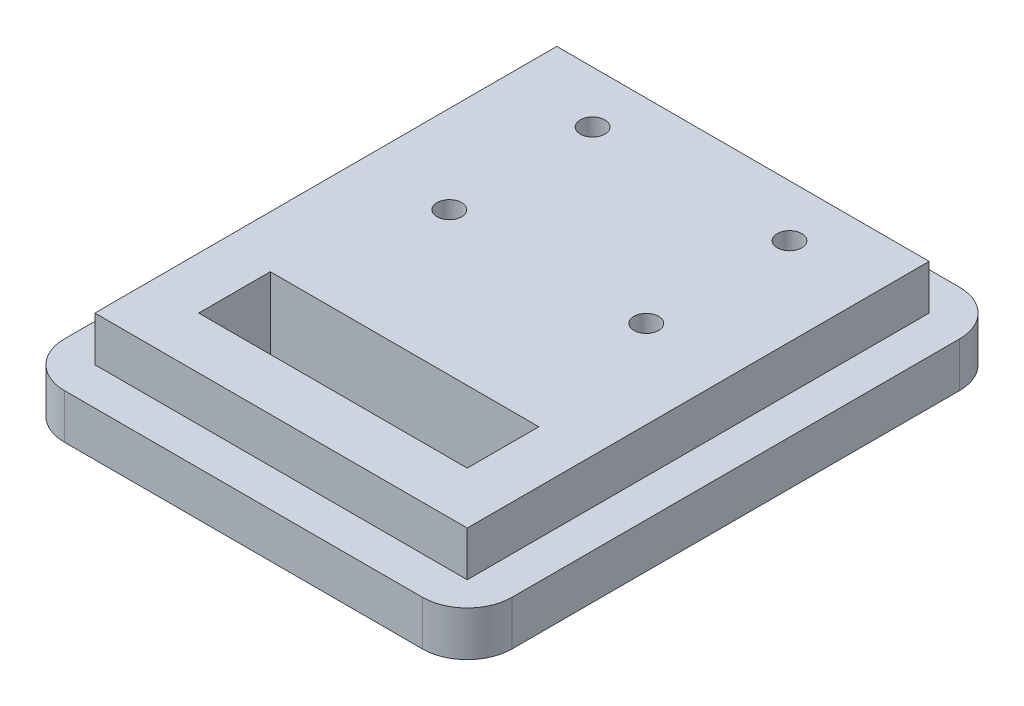
ISO-10303-21;
HEADER;
FILE_DESCRIPTION(('STEP AP214'),'2;1');
FILE_NAME('part.step','',(''),(''),'','','');
FILE_SCHEMA(('AUTOMOTIVE_DESIGN { 1 0 10303 214 1 1 1 1 }'));
ENDSEC;
DATA;
#1=APPLICATION_CONTEXT('core data for automotive mechanical design processes');
#2=APPLICATION_PROTOCOL_DEFINITION('international standard','automotive_design',2000,#1);
#3=PRODUCT_CONTEXT('',#1,'mechanical');
#4=PRODUCT('Part','Part','',(#3));
#5=PRODUCT_RELATED_PRODUCT_CATEGORY('part','',(#4));
#6=PRODUCT_DEFINITION_FORMATION('','',#4);
#7=PRODUCT_DEFINITION_CONTEXT('part definition',#1,'design');
#8=PRODUCT_DEFINITION('design','',#6,#7);
#9=PRODUCT_DEFINITION_SHAPE('','',#8);
#10=(LENGTH_UNIT() NAMED_UNIT(*) SI_UNIT(.MILLI.,.METRE.));
#11=(NAMED_UNIT(*) PLANE_ANGLE_UNIT() SI_UNIT($,.RADIAN.));
#12=(NAMED_UNIT(*) SI_UNIT($,.STERADIAN.) SOLID_ANGLE_UNIT());
#13=UNCERTAINTY_MEASURE_WITH_UNIT(LENGTH_MEASURE(1.E-05),#10,'distance_accuracy_value','');
#14=(GEOMETRIC_REPRESENTATION_CONTEXT(3) GLOBAL_UNCERTAINTY_ASSIGNED_CONTEXT((#13)) GLOBAL_UNIT_ASSIGNED_CONTEXT((#10,
#11,#12)) REPRESENTATION_CONTEXT('',''));
#15=CARTESIAN_POINT('',(0.,0.,0.));
#16=DIRECTION('',(0.,0.,1.));
#17=DIRECTION('',(1.,0.,0.));
#18=AXIS2_PLACEMENT_3D('',#15,#16,#17);
#19=CARTESIAN_POINT('',(15.875,6.35,19.05));
#20=DIRECTION('',(-1.,0.,0.));
#21=DIRECTION('',(0.,0.,1.));
#22=AXIS2_PLACEMENT_3D('',#19,#20,#21);
#23=PLANE('',#22);
#24=DIRECTION('',(0.,0.,-1.));
#25=VECTOR('',#24,1.);
#26=CARTESIAN_POINT('',(15.875,3.175,19.05));
#27=LINE('',#26,#25);
#28=CARTESIAN_POINT('',(15.875,3.175,15.875));
#29=VERTEX_POINT('',#28);
#30=CARTESIAN_POINT('',(15.875,3.175,-15.875));
#31=VERTEX_POINT('',#30);
#32=EDGE_CURVE('E214',#29,#31,#27,.T.);
#33=ORIENTED_EDGE('',*,*,#32,.F.);
#34=DIRECTION('',(0.,-1.,0.));
#35=VECTOR('',#34,1.);
#36=CARTESIAN_POINT('',(15.875,6.35,15.875));
#37=LINE('',#36,#35);
#38=CARTESIAN_POINT('',(15.875,0.,15.875));
#39=VERTEX_POINT('',#38);
#40=EDGE_CURVE('E318',#29,#39,#37,.T.);
#41=ORIENTED_EDGE('',*,*,#40,.T.);
#42=DIRECTION('',(0.,0.,-1.));
#43=VECTOR('',#42,1.);
#44=CARTESIAN_POINT('',(15.875,0.,19.05));
#45=LINE('',#44,#43);
#46=CARTESIAN_POINT('',(15.875,0.,-15.875));
#47=VERTEX_POINT('',#46);
#48=EDGE_CURVE('E297',#39,#47,#45,.T.);
#49=ORIENTED_EDGE('',*,*,#48,.T.);
#50=DIRECTION('',(0.,-1.,0.));
#51=VECTOR('',#50,1.);
#52=CARTESIAN_POINT('',(15.875,6.35,-15.875));
#53=LINE('',#52,#51);
#54=EDGE_CURVE('E315',#47,#31,#53,.F.);
#55=ORIENTED_EDGE('',*,*,#54,.T.);
#56=EDGE_LOOP('',(#33,#41,#49,#55));
#57=FACE_BOUND('',#56,.T.);
#58=ADVANCED_FACE('F39',(#57),#23,.F.);
#59=CARTESIAN_POINT('',(-15.875,6.35,-19.05));
#60=DIRECTION('',(0.,0.,1.));
#61=DIRECTION('',(1.,0.,0.));
#62=AXIS2_PLACEMENT_3D('',#59,#60,#61);
#63=PLANE('',#62);
#64=DIRECTION('',(-1.,0.,0.));
#65=VECTOR('',#64,1.);
#66=CARTESIAN_POINT('',(15.875,3.175,-19.05));
#67=LINE('',#66,#65);
#68=CARTESIAN_POINT('',(12.7,3.175,-19.05));
#69=VERTEX_POINT('',#68);
#70=CARTESIAN_POINT('',(-12.7,3.175,-19.05));
#71=VERTEX_POINT('',#70);
#72=EDGE_CURVE('E218',#69,#71,#67,.T.);
#73=ORIENTED_EDGE('',*,*,#72,.F.);
#74=DIRECTION('',(0.,-1.,0.));
#75=VECTOR('',#74,1.);
#76=CARTESIAN_POINT('',(12.7,6.35,-19.05));
#77=LINE('',#76,#75);
#78=CARTESIAN_POINT('',(12.7,0.,-19.05));
#79=VERTEX_POINT('',#78);
#80=EDGE_CURVE('E11',#69,#79,#77,.T.);
#81=ORIENTED_EDGE('',*,*,#80,.T.);
#82=DIRECTION('',(-1.,0.,0.));
#83=VECTOR('',#82,1.);
#84=CARTESIAN_POINT('',(-15.875,0.,-19.05));
#85=LINE('',#84,#83);
#86=CARTESIAN_POINT('',(-12.7,0.,-19.05));
#87=VERTEX_POINT('',#86);
#88=EDGE_CURVE('E304',#79,#87,#85,.T.);
#89=ORIENTED_EDGE('',*,*,#88,.T.);
#90=DIRECTION('',(0.,-1.,0.));
#91=VECTOR('',#90,1.);
#92=CARTESIAN_POINT('',(-12.7,6.35,-19.05));
#93=LINE('',#92,#91);
#94=EDGE_CURVE('E48',#87,#71,#93,.F.);
#95=ORIENTED_EDGE('',*,*,#94,.T.);
#96=EDGE_LOOP('',(#73,#81,#89,#95));
#97=FACE_BOUND('',#96,.T.);
#98=ADVANCED_FACE('F361',(#97),#63,.F.);
#99=CARTESIAN_POINT('',(-15.875,6.35,19.05));
#100=DIRECTION('',(1.,0.,0.));
#101=DIRECTION('',(0.,0.,-1.));
#102=AXIS2_PLACEMENT_3D('',#99,#100,#101);
#103=PLANE('',#102);
#104=DIRECTION('',(0.,0.,1.));
#105=VECTOR('',#104,1.);
#106=CARTESIAN_POINT('',(-15.875,0.,19.05));
#107=LINE('',#106,#105);
#108=CARTESIAN_POINT('',(-15.875,0.,-15.875));
#109=VERTEX_POINT('',#108);
#110=CARTESIAN_POINT('',(-15.875,0.,15.875));
#111=VERTEX_POINT('',#110);
#112=EDGE_CURVE('E308',#109,#111,#107,.T.);
#113=ORIENTED_EDGE('',*,*,#112,.T.);
#114=DIRECTION('',(0.,-1.,0.));
#115=VECTOR('',#114,1.);
#116=CARTESIAN_POINT('',(-15.875,6.35,15.875));
#117=LINE('',#116,#115);
#118=CARTESIAN_POINT('',(-15.875,3.175,15.875));
#119=VERTEX_POINT('',#118);
#120=EDGE_CURVE('E55',#111,#119,#117,.F.);
#121=ORIENTED_EDGE('',*,*,#120,.T.);
#122=DIRECTION('',(0.,0.,1.));
#123=VECTOR('',#122,1.);
#124=CARTESIAN_POINT('',(-15.875,3.175,-19.05));
#125=LINE('',#124,#123);
#126=CARTESIAN_POINT('',(-15.875,3.175,-15.875));
#127=VERTEX_POINT('',#126);
#128=EDGE_CURVE('E221',#127,#119,#125,.T.);
#129=ORIENTED_EDGE('',*,*,#128,.F.);
#130=DIRECTION('',(0.,-1.,0.));
#131=VECTOR('',#130,1.);
#132=CARTESIAN_POINT('',(-15.875,6.35,-15.875));
#133=LINE('',#132,#131);
#134=EDGE_CURVE('E352',#127,#109,#133,.T.);
#135=ORIENTED_EDGE('',*,*,#134,.T.);
#136=EDGE_LOOP('',(#113,#121,#129,#135));
#137=FACE_BOUND('',#136,.T.);
#138=ADVANCED_FACE('F368',(#137),#103,.F.);
#139=CARTESIAN_POINT('',(-15.875,6.35,19.05));
#140=DIRECTION('',(0.,0.,-1.));
#141=DIRECTION('',(-1.,0.,0.));
#142=AXIS2_PLACEMENT_3D('',#139,#140,#141);
#143=PLANE('',#142);
#144=DIRECTION('',(1.,0.,0.));
#145=VECTOR('',#144,1.);
#146=CARTESIAN_POINT('',(-15.875,0.,19.05));
#147=LINE('',#146,#145);
#148=CARTESIAN_POINT('',(-12.7,0.,19.05));
#149=VERTEX_POINT('',#148);
#150=CARTESIAN_POINT('',(12.7,0.,19.05));
#151=VERTEX_POINT('',#150);
#152=EDGE_CURVE('E311',#149,#151,#147,.T.);
#153=ORIENTED_EDGE('',*,*,#152,.T.);
#154=DIRECTION('',(0.,-1.,0.));
#155=VECTOR('',#154,1.);
#156=CARTESIAN_POINT('',(12.7,6.35,19.05));
#157=LINE('',#156,#155);
#158=CARTESIAN_POINT('',(12.7,3.175,19.05));
#159=VERTEX_POINT('',#158);
#160=EDGE_CURVE('E338',#151,#159,#157,.F.);
#161=ORIENTED_EDGE('',*,*,#160,.T.);
#162=DIRECTION('',(1.,0.,0.));
#163=VECTOR('',#162,1.);
#164=CARTESIAN_POINT('',(-15.875,3.175,19.05));
#165=LINE('',#164,#163);
#166=CARTESIAN_POINT('',(-12.7,3.175,19.05));
#167=VERTEX_POINT('',#166);
#168=EDGE_CURVE('E205',#167,#159,#165,.T.);
#169=ORIENTED_EDGE('',*,*,#168,.F.);
#170=DIRECTION('',(0.,-1.,0.));
#171=VECTOR('',#170,1.);
#172=CARTESIAN_POINT('',(-12.7,6.35,19.05));
#173=LINE('',#172,#171);
#174=EDGE_CURVE('E334',#167,#149,#173,.T.);
#175=ORIENTED_EDGE('',*,*,#174,.T.);
#176=EDGE_LOOP('',(#153,#161,#169,#175));
#177=FACE_BOUND('',#176,.T.);
#178=ADVANCED_FACE('F379',(#177),#143,.F.);
#179=CARTESIAN_POINT('',(0.,6.35,0.));
#180=DIRECTION('',(0.,-1.,0.));
#181=DIRECTION('',(0.,0.,-1.));
#182=AXIS2_PLACEMENT_3D('',#179,#180,#181);
#183=PLANE('',#182);
#184=CARTESIAN_POINT('',(-6.985,6.35,-2.54));
#185=DIRECTION('',(0.,1.,0.));
#186=DIRECTION('',(0.,0.,1.));
#187=AXIS2_PLACEMENT_3D('',#184,#185,#186);
#188=CIRCLE('',#187,0.875);
#189=CARTESIAN_POINT('',(-6.985,6.35,-1.665));
#190=VERTEX_POINT('',#189);
#191=EDGE_CURVE('E281',#190,#190,#188,.T.);
#192=ORIENTED_EDGE('',*,*,#191,.F.);
#193=EDGE_LOOP('',(#192));
#194=FACE_BOUND('',#193,.T.);
#195=CARTESIAN_POINT('',(6.985,6.35,-12.7));
#196=DIRECTION('',(0.,1.,0.));
#197=DIRECTION('',(0.,0.,1.));
#198=AXIS2_PLACEMENT_3D('',#195,#196,#197);
#199=CIRCLE('',#198,0.874999999999999);
#200=CARTESIAN_POINT('',(6.985,6.35,-11.825));
#201=VERTEX_POINT('',#200);
#202=EDGE_CURVE('E259',#201,#201,#199,.T.);
#203=ORIENTED_EDGE('',*,*,#202,.F.);
#204=EDGE_LOOP('',(#203));
#205=FACE_BOUND('',#204,.T.);
#206=CARTESIAN_POINT('',(-6.985,6.35,-12.7));
#207=DIRECTION('',(0.,1.,0.));
#208=DIRECTION('',(0.,0.,1.));
#209=AXIS2_PLACEMENT_3D('',#206,#207,#208);
#210=CIRCLE('',#209,0.875);
#211=CARTESIAN_POINT('',(-6.985,6.35,-11.825));
#212=VERTEX_POINT('',#211);
#213=EDGE_CURVE('E273',#212,#212,#210,.T.);
#214=ORIENTED_EDGE('',*,*,#213,.F.);
#215=EDGE_LOOP('',(#214));
#216=FACE_BOUND('',#215,.T.);
#217=CARTESIAN_POINT('',(6.985,6.35,-2.54));
#218=DIRECTION('',(0.,1.,0.));
#219=DIRECTION('',(0.,0.,1.));
#220=AXIS2_PLACEMENT_3D('',#217,#218,#219);
#221=CIRCLE('',#220,0.874999999999999);
#222=CARTESIAN_POINT('',(6.985,6.35,-1.665));
#223=VERTEX_POINT('',#222);
#224=EDGE_CURVE('E282',#223,#223,#221,.T.);
#225=ORIENTED_EDGE('',*,*,#224,.F.);
#226=EDGE_LOOP('',(#225));
#227=FACE_BOUND('',#226,.T.);
#228=DIRECTION('',(-1.,0.,0.));
#229=VECTOR('',#228,1.);
#230=CARTESIAN_POINT('',(-9.525,6.35,7.62));
#231=LINE('',#230,#229);
#232=CARTESIAN_POINT('',(9.525,6.35,7.62));
#233=VERTEX_POINT('',#232);
#234=CARTESIAN_POINT('',(-9.525,6.35,7.62));
#235=VERTEX_POINT('',#234);
#236=EDGE_CURVE('E245',#233,#235,#231,.T.);
#237=ORIENTED_EDGE('',*,*,#236,.F.);
#238=DIRECTION('',(0.,0.,-1.));
#239=VECTOR('',#238,1.);
#240=CARTESIAN_POINT('',(9.525,6.35,12.7));
#241=LINE('',#240,#239);
#242=CARTESIAN_POINT('',(9.525,6.35,12.7));
#243=VERTEX_POINT('',#242);
#244=EDGE_CURVE('E224',#243,#233,#241,.T.);
#245=ORIENTED_EDGE('',*,*,#244,.F.);
#246=DIRECTION('',(1.,0.,0.));
#247=VECTOR('',#246,1.);
#248=CARTESIAN_POINT('',(-9.525,6.35,12.7));
#249=LINE('',#248,#247);
#250=CARTESIAN_POINT('',(-9.525,6.35,12.7));
#251=VERTEX_POINT('',#250);
#252=EDGE_CURVE('E230',#251,#243,#249,.T.);
#253=ORIENTED_EDGE('',*,*,#252,.F.);
#254=DIRECTION('',(0.,0.,1.));
#255=VECTOR('',#254,1.);
#256=CARTESIAN_POINT('',(-9.525,6.35,12.7));
#257=LINE('',#256,#255);
#258=EDGE_CURVE('E249',#235,#251,#257,.T.);
#259=ORIENTED_EDGE('',*,*,#258,.F.);
#260=EDGE_LOOP('',(#237,#245,#253,#259));
#261=FACE_BOUND('',#260,.T.);
#262=DIRECTION('',(0.,0.,-1.));
#263=VECTOR('',#262,1.);
#264=CARTESIAN_POINT('',(13.208,6.35,16.383));
#265=LINE('',#264,#263);
#266=CARTESIAN_POINT('',(13.208,6.35,16.383));
#267=VERTEX_POINT('',#266);
#268=CARTESIAN_POINT('',(13.208,6.35,-16.383));
#269=VERTEX_POINT('',#268);
#270=EDGE_CURVE('E195',#267,#269,#265,.T.);
#271=ORIENTED_EDGE('',*,*,#270,.T.);
#272=DIRECTION('',(-1.,0.,0.));
#273=VECTOR('',#272,1.);
#274=CARTESIAN_POINT('',(-13.208,6.35,-16.383));
#275=LINE('',#274,#273);
#276=CARTESIAN_POINT('',(-13.208,6.35,-16.383));
#277=VERTEX_POINT('',#276);
#278=EDGE_CURVE('E161',#269,#277,#275,.T.);
#279=ORIENTED_EDGE('',*,*,#278,.T.);
#280=DIRECTION('',(0.,0.,1.));
#281=VECTOR('',#280,1.);
#282=CARTESIAN_POINT('',(-13.208,6.35,16.383));
#283=LINE('',#282,#281);
#284=CARTESIAN_POINT('',(-13.208,6.35,16.383));
#285=VERTEX_POINT('',#284);
#286=EDGE_CURVE('E188',#277,#285,#283,.T.);
#287=ORIENTED_EDGE('',*,*,#286,.T.);
#288=DIRECTION('',(1.,0.,0.));
#289=VECTOR('',#288,1.);
#290=CARTESIAN_POINT('',(-13.208,6.35,16.383));
#291=LINE('',#290,#289);
#292=EDGE_CURVE('E184',#285,#267,#291,.T.);
#293=ORIENTED_EDGE('',*,*,#292,.T.);
#294=EDGE_LOOP('',(#271,#279,#287,#293));
#295=FACE_BOUND('',#294,.T.);
#296=ADVANCED_FACE('F454',(#194,#205,#216,#227,#261,#295),#183,.F.);
#297=CARTESIAN_POINT('',(0.,0.,0.));
#298=DIRECTION('',(0.,-1.,0.));
#299=DIRECTION('',(0.,0.,-1.));
#300=AXIS2_PLACEMENT_3D('',#297,#298,#299);
#301=PLANE('',#300);
#302=DIRECTION('',(0.,0.,-1.));
#303=VECTOR('',#302,1.);
#304=CARTESIAN_POINT('',(9.525,0.,12.7));
#305=LINE('',#304,#303);
#306=CARTESIAN_POINT('',(9.525,0.,12.7));
#307=VERTEX_POINT('',#306);
#308=CARTESIAN_POINT('',(9.525,0.,7.62));
#309=VERTEX_POINT('',#308);
#310=EDGE_CURVE('E225',#307,#309,#305,.T.);
#311=ORIENTED_EDGE('',*,*,#310,.T.);
#312=DIRECTION('',(-1.,0.,0.));
#313=VECTOR('',#312,1.);
#314=CARTESIAN_POINT('',(-9.525,0.,7.62));
#315=LINE('',#314,#313);
#316=CARTESIAN_POINT('',(-9.525,0.,7.62));
#317=VERTEX_POINT('',#316);
#318=EDGE_CURVE('E229',#309,#317,#315,.T.);
#319=ORIENTED_EDGE('',*,*,#318,.T.);
#320=DIRECTION('',(0.,0.,1.));
#321=VECTOR('',#320,1.);
#322=CARTESIAN_POINT('',(-9.525,0.,12.7));
#323=LINE('',#322,#321);
#324=CARTESIAN_POINT('',(-9.525,0.,12.7));
#325=VERTEX_POINT('',#324);
#326=EDGE_CURVE('E234',#317,#325,#323,.T.);
#327=ORIENTED_EDGE('',*,*,#326,.T.);
#328=DIRECTION('',(1.,0.,0.));
#329=VECTOR('',#328,1.);
#330=CARTESIAN_POINT('',(-9.525,0.,12.7));
#331=LINE('',#330,#329);
#332=EDGE_CURVE('E238',#325,#307,#331,.T.);
#333=ORIENTED_EDGE('',*,*,#332,.T.);
#334=EDGE_LOOP('',(#311,#319,#327,#333));
#335=FACE_BOUND('',#334,.T.);
#336=CARTESIAN_POINT('',(6.985,0.,-2.54));
#337=DIRECTION('',(0.,1.,0.));
#338=DIRECTION('',(0.,0.,1.));
#339=AXIS2_PLACEMENT_3D('',#336,#337,#338);
#340=CIRCLE('',#339,0.874999999999999);
#341=CARTESIAN_POINT('',(6.985,0.,-1.665));
#342=VERTEX_POINT('',#341);
#343=EDGE_CURVE('E277',#342,#342,#340,.T.);
#344=ORIENTED_EDGE('',*,*,#343,.T.);
#345=EDGE_LOOP('',(#344));
#346=FACE_BOUND('',#345,.T.);
#347=CARTESIAN_POINT('',(-6.985,0.,-12.7));
#348=DIRECTION('',(0.,1.,0.));
#349=DIRECTION('',(0.,0.,1.));
#350=AXIS2_PLACEMENT_3D('',#347,#348,#349);
#351=CIRCLE('',#350,0.875);
#352=CARTESIAN_POINT('',(-6.985,0.,-11.825));
#353=VERTEX_POINT('',#352);
#354=EDGE_CURVE('E286',#353,#353,#351,.T.);
#355=ORIENTED_EDGE('',*,*,#354,.T.);
#356=EDGE_LOOP('',(#355));
#357=FACE_BOUND('',#356,.T.);
#358=CARTESIAN_POINT('',(6.985,0.,-12.7));
#359=DIRECTION('',(0.,1.,0.));
#360=DIRECTION('',(0.,0.,1.));
#361=AXIS2_PLACEMENT_3D('',#358,#359,#360);
#362=CIRCLE('',#361,0.874999999999999);
#363=CARTESIAN_POINT('',(6.985,0.,-11.825));
#364=VERTEX_POINT('',#363);
#365=EDGE_CURVE('E269',#364,#364,#362,.T.);
#366=ORIENTED_EDGE('',*,*,#365,.T.);
#367=EDGE_LOOP('',(#366));
#368=FACE_BOUND('',#367,.T.);
#369=CARTESIAN_POINT('',(-6.985,0.,-2.54));
#370=DIRECTION('',(0.,1.,0.));
#371=DIRECTION('',(0.,0.,1.));
#372=AXIS2_PLACEMENT_3D('',#369,#370,#371);
#373=CIRCLE('',#372,0.875);
#374=CARTESIAN_POINT('',(-6.985,0.,-1.665));
#375=VERTEX_POINT('',#374);
#376=EDGE_CURVE('E293',#375,#375,#373,.T.);
#377=ORIENTED_EDGE('',*,*,#376,.T.);
#378=EDGE_LOOP('',(#377));
#379=FACE_BOUND('',#378,.T.);
#380=ORIENTED_EDGE('',*,*,#48,.F.);
#381=CARTESIAN_POINT('',(12.7,0.,15.875));
#382=DIRECTION('',(0.,-1.,0.));
#383=DIRECTION('',(0.,0.,-1.));
#384=AXIS2_PLACEMENT_3D('',#381,#382,#383);
#385=CIRCLE('',#384,3.175);
#386=EDGE_CURVE('E331',#39,#151,#385,.T.);
#387=ORIENTED_EDGE('',*,*,#386,.T.);
#388=ORIENTED_EDGE('',*,*,#152,.F.);
#389=CARTESIAN_POINT('',(-12.7,0.,15.875));
#390=DIRECTION('',(0.,-1.,0.));
#391=DIRECTION('',(0.,0.,-1.));
#392=AXIS2_PLACEMENT_3D('',#389,#390,#391);
#393=CIRCLE('',#392,3.175);
#394=EDGE_CURVE('E328',#149,#111,#393,.T.);
#395=ORIENTED_EDGE('',*,*,#394,.T.);
#396=ORIENTED_EDGE('',*,*,#112,.F.);
#397=CARTESIAN_POINT('',(-12.7,0.,-15.875));
#398=DIRECTION('',(0.,-1.,0.));
#399=DIRECTION('',(0.,0.,-1.));
#400=AXIS2_PLACEMENT_3D('',#397,#398,#399);
#401=CIRCLE('',#400,3.175);
#402=EDGE_CURVE('E322',#109,#87,#401,.T.);
#403=ORIENTED_EDGE('',*,*,#402,.T.);
#404=ORIENTED_EDGE('',*,*,#88,.F.);
#405=CARTESIAN_POINT('',(12.7,0.,-15.875));
#406=DIRECTION('',(0.,-1.,0.));
#407=DIRECTION('',(0.,0.,-1.));
#408=AXIS2_PLACEMENT_3D('',#405,#406,#407);
#409=CIRCLE('',#408,3.175);
#410=EDGE_CURVE('E325',#79,#47,#409,.T.);
#411=ORIENTED_EDGE('',*,*,#410,.T.);
#412=EDGE_LOOP('',(#380,#387,#388,#395,#396,#403,#404,#411));
#413=FACE_BOUND('',#412,.T.);
#414=ADVANCED_FACE('F371',(#335,#346,#357,#368,#379,#413),#301,.T.);
#415=CARTESIAN_POINT('',(-6.985,0.,-2.54));
#416=DIRECTION('',(0.,1.,0.));
#417=DIRECTION('',(0.,0.,1.));
#418=AXIS2_PLACEMENT_3D('',#415,#416,#417);
#419=CYLINDRICAL_SURFACE('',#418,0.875);
#420=ORIENTED_EDGE('',*,*,#376,.F.);
#421=EDGE_LOOP('',(#420));
#422=FACE_BOUND('',#421,.T.);
#423=ORIENTED_EDGE('',*,*,#191,.T.);
#424=EDGE_LOOP('',(#423));
#425=FACE_BOUND('',#424,.T.);
#426=ADVANCED_FACE('F443',(#422,#425),#419,.F.);
#427=CARTESIAN_POINT('',(6.985,0.,-12.7));
#428=DIRECTION('',(0.,1.,0.));
#429=DIRECTION('',(0.,0.,1.));
#430=AXIS2_PLACEMENT_3D('',#427,#428,#429);
#431=CYLINDRICAL_SURFACE('',#430,0.874999999999999);
#432=ORIENTED_EDGE('',*,*,#365,.F.);
#433=EDGE_LOOP('',(#432));
#434=FACE_BOUND('',#433,.T.);
#435=ORIENTED_EDGE('',*,*,#202,.T.);
#436=EDGE_LOOP('',(#435));
#437=FACE_BOUND('',#436,.T.);
#438=ADVANCED_FACE('F439',(#434,#437),#431,.F.);
#439=CARTESIAN_POINT('',(-6.985,0.,-12.7));
#440=DIRECTION('',(0.,1.,0.));
#441=DIRECTION('',(0.,0.,1.));
#442=AXIS2_PLACEMENT_3D('',#439,#440,#441);
#443=CYLINDRICAL_SURFACE('',#442,0.875);
#444=ORIENTED_EDGE('',*,*,#354,.F.);
#445=EDGE_LOOP('',(#444));
#446=FACE_BOUND('',#445,.T.);
#447=ORIENTED_EDGE('',*,*,#213,.T.);
#448=EDGE_LOOP('',(#447));
#449=FACE_BOUND('',#448,.T.);
#450=ADVANCED_FACE('F442',(#446,#449),#443,.F.);
#451=CARTESIAN_POINT('',(6.985,0.,-2.54));
#452=DIRECTION('',(0.,1.,0.));
#453=DIRECTION('',(0.,0.,1.));
#454=AXIS2_PLACEMENT_3D('',#451,#452,#453);
#455=CYLINDRICAL_SURFACE('',#454,0.874999999999999);
#456=ORIENTED_EDGE('',*,*,#343,.F.);
#457=EDGE_LOOP('',(#456));
#458=FACE_BOUND('',#457,.T.);
#459=ORIENTED_EDGE('',*,*,#224,.T.);
#460=EDGE_LOOP('',(#459));
#461=FACE_BOUND('',#460,.T.);
#462=ADVANCED_FACE('F437',(#458,#461),#455,.F.);
#463=CARTESIAN_POINT('',(9.525,0.,12.7));
#464=DIRECTION('',(1.,0.,0.));
#465=DIRECTION('',(0.,0.,-1.));
#466=AXIS2_PLACEMENT_3D('',#463,#464,#465);
#467=PLANE('',#466);
#468=ORIENTED_EDGE('',*,*,#244,.T.);
#469=DIRECTION('',(0.,1.,0.));
#470=VECTOR('',#469,1.);
#471=CARTESIAN_POINT('',(9.525,0.,7.62));
#472=LINE('',#471,#470);
#473=EDGE_CURVE('E242',#309,#233,#472,.T.);
#474=ORIENTED_EDGE('',*,*,#473,.F.);
#475=ORIENTED_EDGE('',*,*,#310,.F.);
#476=DIRECTION('',(0.,1.,0.));
#477=VECTOR('',#476,1.);
#478=CARTESIAN_POINT('',(9.525,0.,12.7));
#479=LINE('',#478,#477);
#480=EDGE_CURVE('E256',#307,#243,#479,.T.);
#481=ORIENTED_EDGE('',*,*,#480,.T.);
#482=EDGE_LOOP('',(#468,#474,#475,#481));
#483=FACE_BOUND('',#482,.T.);
#484=ADVANCED_FACE('F427',(#483),#467,.F.);
#485=CARTESIAN_POINT('',(-9.525,0.,12.7));
#486=DIRECTION('',(0.,0.,1.));
#487=DIRECTION('',(1.,0.,0.));
#488=AXIS2_PLACEMENT_3D('',#485,#486,#487);
#489=PLANE('',#488);
#490=ORIENTED_EDGE('',*,*,#252,.T.);
#491=ORIENTED_EDGE('',*,*,#480,.F.);
#492=ORIENTED_EDGE('',*,*,#332,.F.);
#493=DIRECTION('',(0.,1.,0.));
#494=VECTOR('',#493,1.);
#495=CARTESIAN_POINT('',(-9.525,0.,12.7));
#496=LINE('',#495,#494);
#497=EDGE_CURVE('E260',#325,#251,#496,.T.);
#498=ORIENTED_EDGE('',*,*,#497,.T.);
#499=EDGE_LOOP('',(#490,#491,#492,#498));
#500=FACE_BOUND('',#499,.T.);
#501=ADVANCED_FACE('F423',(#500),#489,.F.);
#502=CARTESIAN_POINT('',(-9.525,0.,12.7));
#503=DIRECTION('',(-1.,0.,0.));
#504=DIRECTION('',(0.,0.,1.));
#505=AXIS2_PLACEMENT_3D('',#502,#503,#504);
#506=PLANE('',#505);
#507=ORIENTED_EDGE('',*,*,#258,.T.);
#508=ORIENTED_EDGE('',*,*,#497,.F.);
#509=ORIENTED_EDGE('',*,*,#326,.F.);
#510=DIRECTION('',(0.,1.,0.));
#511=VECTOR('',#510,1.);
#512=CARTESIAN_POINT('',(-9.525,0.,7.62));
#513=LINE('',#512,#511);
#514=EDGE_CURVE('E263',#317,#235,#513,.T.);
#515=ORIENTED_EDGE('',*,*,#514,.T.);
#516=EDGE_LOOP('',(#507,#508,#509,#515));
#517=FACE_BOUND('',#516,.T.);
#518=ADVANCED_FACE('F426',(#517),#506,.F.);
#519=CARTESIAN_POINT('',(-9.525,0.,7.62));
#520=DIRECTION('',(0.,0.,-1.));
#521=DIRECTION('',(-1.,0.,0.));
#522=AXIS2_PLACEMENT_3D('',#519,#520,#521);
#523=PLANE('',#522);
#524=ORIENTED_EDGE('',*,*,#236,.T.);
#525=ORIENTED_EDGE('',*,*,#514,.F.);
#526=ORIENTED_EDGE('',*,*,#318,.F.);
#527=ORIENTED_EDGE('',*,*,#473,.T.);
#528=EDGE_LOOP('',(#524,#525,#526,#527));
#529=FACE_BOUND('',#528,.T.);
#530=ADVANCED_FACE('F422',(#529),#523,.F.);
#531=CARTESIAN_POINT('',(0.,3.175,0.));
#532=DIRECTION('',(0.,1.,0.));
#533=DIRECTION('',(0.,0.,1.));
#534=AXIS2_PLACEMENT_3D('',#531,#532,#533);
#535=PLANE('',#534);
#536=DIRECTION('',(1.,0.,0.));
#537=VECTOR('',#536,1.);
#538=CARTESIAN_POINT('',(-13.208,3.175,16.383));
#539=LINE('',#538,#537);
#540=CARTESIAN_POINT('',(-13.208,3.175,16.383));
#541=VERTEX_POINT('',#540);
#542=CARTESIAN_POINT('',(13.208,3.175,16.383));
#543=VERTEX_POINT('',#542);
#544=EDGE_CURVE('E168',#541,#543,#539,.T.);
#545=ORIENTED_EDGE('',*,*,#544,.F.);
#546=DIRECTION('',(0.,0.,1.));
#547=VECTOR('',#546,1.);
#548=CARTESIAN_POINT('',(-13.208,3.175,16.383));
#549=LINE('',#548,#547);
#550=CARTESIAN_POINT('',(-13.208,3.175,-16.383));
#551=VERTEX_POINT('',#550);
#552=EDGE_CURVE('E177',#551,#541,#549,.T.);
#553=ORIENTED_EDGE('',*,*,#552,.F.);
#554=DIRECTION('',(-1.,0.,0.));
#555=VECTOR('',#554,1.);
#556=CARTESIAN_POINT('',(-13.208,3.175,-16.383));
#557=LINE('',#556,#555);
#558=CARTESIAN_POINT('',(13.208,3.175,-16.383));
#559=VERTEX_POINT('',#558);
#560=EDGE_CURVE('E159',#559,#551,#557,.T.);
#561=ORIENTED_EDGE('',*,*,#560,.F.);
#562=DIRECTION('',(0.,0.,-1.));
#563=VECTOR('',#562,1.);
#564=CARTESIAN_POINT('',(13.208,3.175,16.383));
#565=LINE('',#564,#563);
#566=EDGE_CURVE('E174',#543,#559,#565,.T.);
#567=ORIENTED_EDGE('',*,*,#566,.F.);
#568=EDGE_LOOP('',(#545,#553,#561,#567));
#569=FACE_BOUND('',#568,.T.);
#570=ORIENTED_EDGE('',*,*,#168,.T.);
#571=CARTESIAN_POINT('',(12.7,3.175,15.875));
#572=DIRECTION('',(0.,1.,0.));
#573=DIRECTION('',(0.,0.,1.));
#574=AXIS2_PLACEMENT_3D('',#571,#572,#573);
#575=CIRCLE('',#574,3.175);
#576=EDGE_CURVE('E349',#159,#29,#575,.T.);
#577=ORIENTED_EDGE('',*,*,#576,.T.);
#578=ORIENTED_EDGE('',*,*,#32,.T.);
#579=CARTESIAN_POINT('',(12.7,3.175,-15.875));
#580=DIRECTION('',(0.,1.,0.));
#581=DIRECTION('',(0.,0.,1.));
#582=AXIS2_PLACEMENT_3D('',#579,#580,#581);
#583=CIRCLE('',#582,3.175);
#584=EDGE_CURVE('E343',#31,#69,#583,.T.);
#585=ORIENTED_EDGE('',*,*,#584,.T.);
#586=ORIENTED_EDGE('',*,*,#72,.T.);
#587=CARTESIAN_POINT('',(-12.7,3.175,-15.875));
#588=DIRECTION('',(0.,1.,0.));
#589=DIRECTION('',(0.,0.,1.));
#590=AXIS2_PLACEMENT_3D('',#587,#588,#589);
#591=CIRCLE('',#590,3.175);
#592=EDGE_CURVE('E62',#71,#127,#591,.T.);
#593=ORIENTED_EDGE('',*,*,#592,.T.);
#594=ORIENTED_EDGE('',*,*,#128,.T.);
#595=CARTESIAN_POINT('',(-12.7,3.175,15.875));
#596=DIRECTION('',(0.,1.,0.));
#597=DIRECTION('',(0.,0.,1.));
#598=AXIS2_PLACEMENT_3D('',#595,#596,#597);
#599=CIRCLE('',#598,3.175);
#600=EDGE_CURVE('E346',#119,#167,#599,.T.);
#601=ORIENTED_EDGE('',*,*,#600,.T.);
#602=EDGE_LOOP('',(#570,#577,#578,#585,#586,#593,#594,#601));
#603=FACE_BOUND('',#602,.T.);
#604=ADVANCED_FACE('F173',(#569,#603),#535,.T.);
#605=CARTESIAN_POINT('',(13.208,3.175,16.383));
#606=DIRECTION('',(1.,0.,0.));
#607=DIRECTION('',(0.,0.,-1.));
#608=AXIS2_PLACEMENT_3D('',#605,#606,#607);
#609=PLANE('',#608);
#610=ORIENTED_EDGE('',*,*,#270,.F.);
#611=DIRECTION('',(0.,1.,0.));
#612=VECTOR('',#611,1.);
#613=CARTESIAN_POINT('',(13.208,3.175,16.383));
#614=LINE('',#613,#612);
#615=EDGE_CURVE('E182',#543,#267,#614,.T.);
#616=ORIENTED_EDGE('',*,*,#615,.F.);
#617=ORIENTED_EDGE('',*,*,#566,.T.);
#618=DIRECTION('',(0.,1.,0.));
#619=VECTOR('',#618,1.);
#620=CARTESIAN_POINT('',(13.208,3.175,-16.383));
#621=LINE('',#620,#619);
#622=EDGE_CURVE('E155',#559,#269,#621,.T.);
#623=ORIENTED_EDGE('',*,*,#622,.T.);
#624=EDGE_LOOP('',(#610,#616,#617,#623));
#625=FACE_BOUND('',#624,.T.);
#626=ADVANCED_FACE('F181',(#625),#609,.T.);
#627=CARTESIAN_POINT('',(-13.208,3.175,16.383));
#628=DIRECTION('',(0.,0.,1.));
#629=DIRECTION('',(1.,0.,0.));
#630=AXIS2_PLACEMENT_3D('',#627,#628,#629);
#631=PLANE('',#630);
#632=ORIENTED_EDGE('',*,*,#292,.F.);
#633=DIRECTION('',(0.,1.,0.));
#634=VECTOR('',#633,1.);
#635=CARTESIAN_POINT('',(-13.208,3.175,16.383));
#636=LINE('',#635,#634);
#637=EDGE_CURVE('E206',#541,#285,#636,.T.);
#638=ORIENTED_EDGE('',*,*,#637,.F.);
#639=ORIENTED_EDGE('',*,*,#544,.T.);
#640=ORIENTED_EDGE('',*,*,#615,.T.);
#641=EDGE_LOOP('',(#632,#638,#639,#640));
#642=FACE_BOUND('',#641,.T.);
#643=ADVANCED_FACE('F413',(#642),#631,.T.);
#644=CARTESIAN_POINT('',(-13.208,3.175,16.383));
#645=DIRECTION('',(-1.,0.,0.));
#646=DIRECTION('',(0.,0.,1.));
#647=AXIS2_PLACEMENT_3D('',#644,#645,#646);
#648=PLANE('',#647);
#649=ORIENTED_EDGE('',*,*,#286,.F.);
#650=DIRECTION('',(0.,1.,0.));
#651=VECTOR('',#650,1.);
#652=CARTESIAN_POINT('',(-13.208,3.175,-16.383));
#653=LINE('',#652,#651);
#654=EDGE_CURVE('E167',#551,#277,#653,.T.);
#655=ORIENTED_EDGE('',*,*,#654,.F.);
#656=ORIENTED_EDGE('',*,*,#552,.T.);
#657=ORIENTED_EDGE('',*,*,#637,.T.);
#658=EDGE_LOOP('',(#649,#655,#656,#657));
#659=FACE_BOUND('',#658,.T.);
#660=ADVANCED_FACE('F408',(#659),#648,.T.);
#661=CARTESIAN_POINT('',(-13.208,3.175,-16.383));
#662=DIRECTION('',(0.,0.,-1.));
#663=DIRECTION('',(-1.,0.,0.));
#664=AXIS2_PLACEMENT_3D('',#661,#662,#663);
#665=PLANE('',#664);
#666=ORIENTED_EDGE('',*,*,#278,.F.);
#667=ORIENTED_EDGE('',*,*,#622,.F.);
#668=ORIENTED_EDGE('',*,*,#560,.T.);
#669=ORIENTED_EDGE('',*,*,#654,.T.);
#670=EDGE_LOOP('',(#666,#667,#668,#669));
#671=FACE_BOUND('',#670,.T.);
#672=ADVANCED_FACE('F157',(#671),#665,.T.);
#673=CARTESIAN_POINT('',(12.7,6.35,15.875));
#674=DIRECTION('',(0.,-1.,0.));
#675=DIRECTION('',(0.,0.,-1.));
#676=AXIS2_PLACEMENT_3D('',#673,#674,#675);
#677=CYLINDRICAL_SURFACE('',#676,3.175);
#678=ORIENTED_EDGE('',*,*,#576,.F.);
#679=ORIENTED_EDGE('',*,*,#160,.F.);
#680=ORIENTED_EDGE('',*,*,#386,.F.);
#681=ORIENTED_EDGE('',*,*,#40,.F.);
#682=EDGE_LOOP('',(#678,#679,#680,#681));
#683=FACE_BOUND('',#682,.T.);
#684=ADVANCED_FACE('F385',(#683),#677,.T.);
#685=CARTESIAN_POINT('',(-12.7,6.35,15.875));
#686=DIRECTION('',(0.,-1.,0.));
#687=DIRECTION('',(0.,0.,-1.));
#688=AXIS2_PLACEMENT_3D('',#685,#686,#687);
#689=CYLINDRICAL_SURFACE('',#688,3.175);
#690=ORIENTED_EDGE('',*,*,#600,.F.);
#691=ORIENTED_EDGE('',*,*,#120,.F.);
#692=ORIENTED_EDGE('',*,*,#394,.F.);
#693=ORIENTED_EDGE('',*,*,#174,.F.);
#694=EDGE_LOOP('',(#690,#691,#692,#693));
#695=FACE_BOUND('',#694,.T.);
#696=ADVANCED_FACE('F376',(#695),#689,.T.);
#697=CARTESIAN_POINT('',(12.7,6.35,-15.875));
#698=DIRECTION('',(0.,-1.,0.));
#699=DIRECTION('',(0.,0.,-1.));
#700=AXIS2_PLACEMENT_3D('',#697,#698,#699);
#701=CYLINDRICAL_SURFACE('',#700,3.175);
#702=ORIENTED_EDGE('',*,*,#584,.F.);
#703=ORIENTED_EDGE('',*,*,#54,.F.);
#704=ORIENTED_EDGE('',*,*,#410,.F.);
#705=ORIENTED_EDGE('',*,*,#80,.F.);
#706=EDGE_LOOP('',(#702,#703,#704,#705));
#707=FACE_BOUND('',#706,.T.);
#708=ADVANCED_FACE('F389',(#707),#701,.T.);
#709=CARTESIAN_POINT('',(-12.7,6.35,-15.875));
#710=DIRECTION('',(0.,-1.,0.));
#711=DIRECTION('',(0.,0.,-1.));
#712=AXIS2_PLACEMENT_3D('',#709,#710,#711);
#713=CYLINDRICAL_SURFACE('',#712,3.175);
#714=ORIENTED_EDGE('',*,*,#592,.F.);
#715=ORIENTED_EDGE('',*,*,#94,.F.);
#716=ORIENTED_EDGE('',*,*,#402,.F.);
#717=ORIENTED_EDGE('',*,*,#134,.F.);
#718=EDGE_LOOP('',(#714,#715,#716,#717));
#719=FACE_BOUND('',#718,.T.);
#720=ADVANCED_FACE('F41',(#719),#713,.T.);
#721=CLOSED_SHELL('',(#58,#98,#138,#178,#296,#414,#426,#438,#450,#462,#484,#501,#518,#530,#604,
#626,#643,#660,#672,#684,#696,#708,#720));
#722=MANIFOLD_SOLID_BREP('B2',#721);
#723=ADVANCED_BREP_SHAPE_REPRESENTATION('',(#18,#722),#14);
#724=SHAPE_DEFINITION_REPRESENTATION(#9,#723);
ENDSEC;
END-ISO-10303-21;
